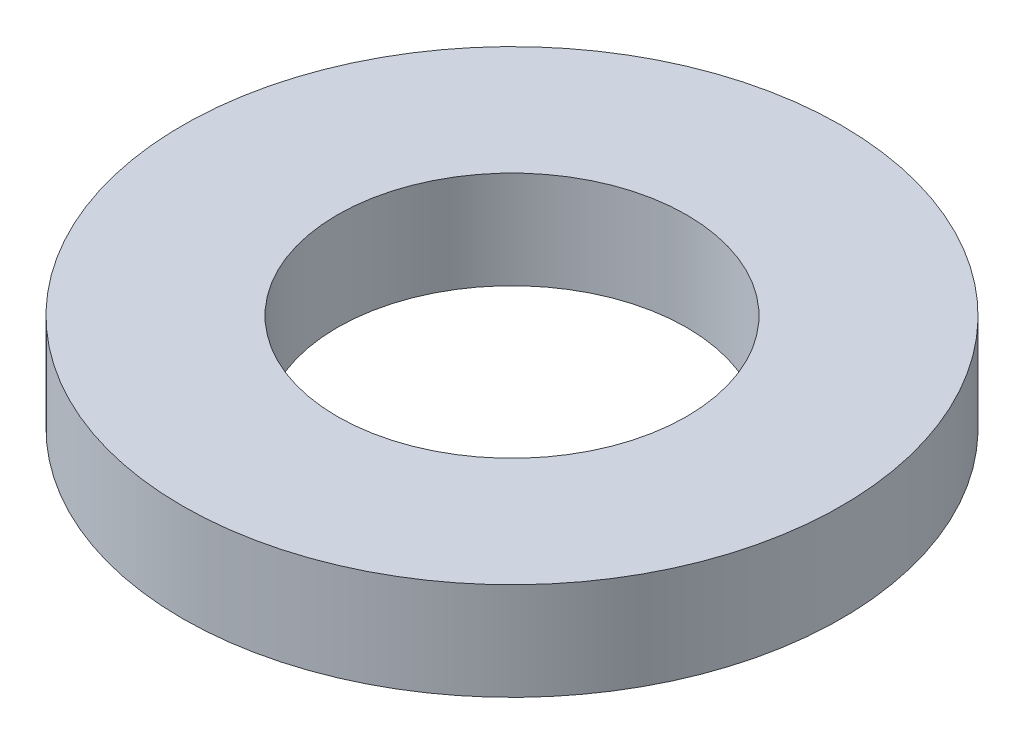
ISO-10303-21;
HEADER;
FILE_DESCRIPTION(('STEP AP214'),'2;1');
FILE_NAME('part.step','',(''),(''),'','','');
FILE_SCHEMA(('AUTOMOTIVE_DESIGN { 1 0 10303 214 1 1 1 1 }'));
ENDSEC;
DATA;
#1=APPLICATION_CONTEXT('core data for automotive mechanical design processes');
#2=APPLICATION_PROTOCOL_DEFINITION('international standard','automotive_design',2000,#1);
#3=PRODUCT_CONTEXT('',#1,'mechanical');
#4=PRODUCT('Part','Part','',(#3));
#5=PRODUCT_RELATED_PRODUCT_CATEGORY('part','',(#4));
#6=PRODUCT_DEFINITION_FORMATION('','',#4);
#7=PRODUCT_DEFINITION_CONTEXT('part definition',#1,'design');
#8=PRODUCT_DEFINITION('design','',#6,#7);
#9=PRODUCT_DEFINITION_SHAPE('','',#8);
#10=(LENGTH_UNIT() NAMED_UNIT(*) SI_UNIT(.MILLI.,.METRE.));
#11=(NAMED_UNIT(*) PLANE_ANGLE_UNIT() SI_UNIT($,.RADIAN.));
#12=(NAMED_UNIT(*) SI_UNIT($,.STERADIAN.) SOLID_ANGLE_UNIT());
#13=UNCERTAINTY_MEASURE_WITH_UNIT(LENGTH_MEASURE(1.E-05),#10,'distance_accuracy_value','');
#14=(GEOMETRIC_REPRESENTATION_CONTEXT(3) GLOBAL_UNCERTAINTY_ASSIGNED_CONTEXT((#13)) GLOBAL_UNIT_ASSIGNED_CONTEXT((#10,
#11,#12)) REPRESENTATION_CONTEXT('',''));
#15=CARTESIAN_POINT('',(0.,0.,0.));
#16=DIRECTION('',(0.,0.,1.));
#17=DIRECTION('',(1.,0.,0.));
#18=AXIS2_PLACEMENT_3D('',#15,#16,#17);
#19=CARTESIAN_POINT('',(0.,1.8796,0.));
#20=DIRECTION('',(0.,-1.,0.));
#21=DIRECTION('',(0.,0.,-1.));
#22=AXIS2_PLACEMENT_3D('',#19,#20,#21);
#23=CYLINDRICAL_SURFACE('',#22,6.35);
#24=CARTESIAN_POINT('',(0.,1.8796,0.));
#25=DIRECTION('',(0.,1.,0.));
#26=DIRECTION('',(0.,0.,1.));
#27=AXIS2_PLACEMENT_3D('',#24,#25,#26);
#28=CIRCLE('',#27,6.35);
#29=CARTESIAN_POINT('',(0.,1.8796,6.35));
#30=VERTEX_POINT('',#29);
#31=EDGE_CURVE('E10',#30,#30,#28,.T.);
#32=ORIENTED_EDGE('',*,*,#31,.F.);
#33=EDGE_LOOP('',(#32));
#34=FACE_BOUND('',#33,.T.);
#35=CARTESIAN_POINT('',(0.,0.,0.));
#36=DIRECTION('',(0.,1.,0.));
#37=DIRECTION('',(0.,0.,1.));
#38=AXIS2_PLACEMENT_3D('',#35,#36,#37);
#39=CIRCLE('',#38,6.35);
#40=CARTESIAN_POINT('',(0.,0.,6.35));
#41=VERTEX_POINT('',#40);
#42=EDGE_CURVE('E33',#41,#41,#39,.T.);
#43=ORIENTED_EDGE('',*,*,#42,.T.);
#44=EDGE_LOOP('',(#43));
#45=FACE_BOUND('',#44,.T.);
#46=ADVANCED_FACE('F30',(#34,#45),#23,.T.);
#47=CARTESIAN_POINT('',(0.,1.8796,0.));
#48=DIRECTION('',(0.,1.,0.));
#49=DIRECTION('',(0.,0.,1.));
#50=AXIS2_PLACEMENT_3D('',#47,#48,#49);
#51=PLANE('',#50);
#52=CARTESIAN_POINT('',(0.,1.8796,0.));
#53=DIRECTION('',(0.,1.,0.));
#54=DIRECTION('',(0.,0.,1.));
#55=AXIS2_PLACEMENT_3D('',#52,#53,#54);
#56=CIRCLE('',#55,3.3655);
#57=CARTESIAN_POINT('',(0.,1.8796,3.3655));
#58=VERTEX_POINT('',#57);
#59=EDGE_CURVE('E42',#58,#58,#56,.T.);
#60=ORIENTED_EDGE('',*,*,#59,.F.);
#61=EDGE_LOOP('',(#60));
#62=FACE_BOUND('',#61,.T.);
#63=ORIENTED_EDGE('',*,*,#31,.T.);
#64=EDGE_LOOP('',(#63));
#65=FACE_BOUND('',#64,.T.);
#66=ADVANCED_FACE('F57',(#62,#65),#51,.T.);
#67=CARTESIAN_POINT('',(0.,0.,0.));
#68=DIRECTION('',(0.,1.,0.));
#69=DIRECTION('',(0.,0.,1.));
#70=AXIS2_PLACEMENT_3D('',#67,#68,#69);
#71=PLANE('',#70);
#72=CARTESIAN_POINT('',(0.,0.,0.));
#73=DIRECTION('',(0.,1.,0.));
#74=DIRECTION('',(0.,0.,1.));
#75=AXIS2_PLACEMENT_3D('',#72,#73,#74);
#76=CIRCLE('',#75,3.3655);
#77=CARTESIAN_POINT('',(0.,0.,3.3655));
#78=VERTEX_POINT('',#77);
#79=EDGE_CURVE('E40',#78,#78,#76,.T.);
#80=ORIENTED_EDGE('',*,*,#79,.T.);
#81=EDGE_LOOP('',(#80));
#82=FACE_BOUND('',#81,.T.);
#83=ORIENTED_EDGE('',*,*,#42,.F.);
#84=EDGE_LOOP('',(#83));
#85=FACE_BOUND('',#84,.T.);
#86=ADVANCED_FACE('F48',(#82,#85),#71,.F.);
#87=CARTESIAN_POINT('',(0.,0.,0.));
#88=DIRECTION('',(0.,1.,0.));
#89=DIRECTION('',(0.,0.,1.));
#90=AXIS2_PLACEMENT_3D('',#87,#88,#89);
#91=CYLINDRICAL_SURFACE('',#90,3.3655);
#92=ORIENTED_EDGE('',*,*,#79,.F.);
#93=EDGE_LOOP('',(#92));
#94=FACE_BOUND('',#93,.T.);
#95=ORIENTED_EDGE('',*,*,#59,.T.);
#96=EDGE_LOOP('',(#95));
#97=FACE_BOUND('',#96,.T.);
#98=ADVANCED_FACE('F51',(#94,#97),#91,.F.);
#99=CLOSED_SHELL('',(#46,#66,#86,#98));
#100=MANIFOLD_SOLID_BREP('B2',#99);
#101=ADVANCED_BREP_SHAPE_REPRESENTATION('',(#18,#100),#14);
#102=SHAPE_DEFINITION_REPRESENTATION(#9,#101);
ENDSEC;
END-ISO-10303-21;
